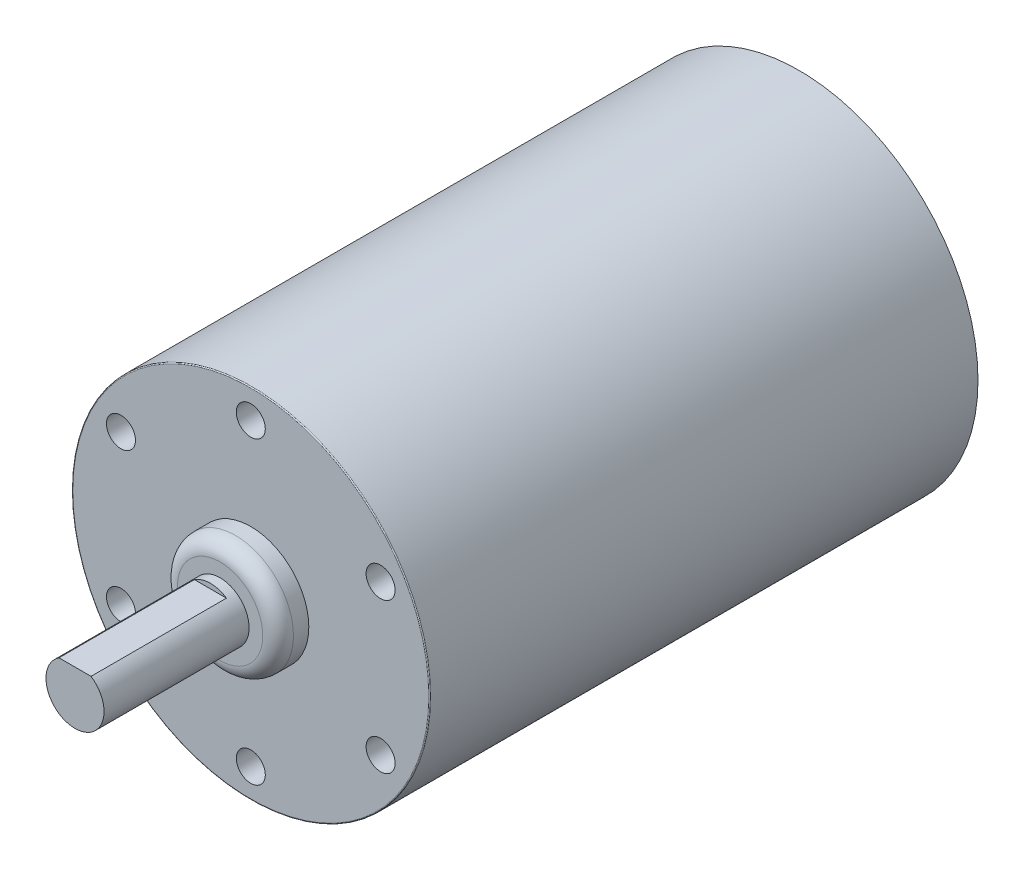
ISO-10303-21;
HEADER;
FILE_DESCRIPTION(('STEP AP214'),'2;1');
FILE_NAME('part.step','',(''),(''),'','','');
FILE_SCHEMA(('AUTOMOTIVE_DESIGN { 1 0 10303 214 1 1 1 1 }'));
ENDSEC;
DATA;
#1=APPLICATION_CONTEXT('core data for automotive mechanical design processes');
#2=APPLICATION_PROTOCOL_DEFINITION('international standard','automotive_design',2000,#1);
#3=PRODUCT_CONTEXT('',#1,'mechanical');
#4=PRODUCT('Part','Part','',(#3));
#5=PRODUCT_RELATED_PRODUCT_CATEGORY('part','',(#4));
#6=PRODUCT_DEFINITION_FORMATION('','',#4);
#7=PRODUCT_DEFINITION_CONTEXT('part definition',#1,'design');
#8=PRODUCT_DEFINITION('design','',#6,#7);
#9=PRODUCT_DEFINITION_SHAPE('','',#8);
#10=(LENGTH_UNIT() NAMED_UNIT(*) SI_UNIT(.MILLI.,.METRE.));
#11=(NAMED_UNIT(*) PLANE_ANGLE_UNIT() SI_UNIT($,.RADIAN.));
#12=(NAMED_UNIT(*) SI_UNIT($,.STERADIAN.) SOLID_ANGLE_UNIT());
#13=UNCERTAINTY_MEASURE_WITH_UNIT(LENGTH_MEASURE(1.E-05),#10,'distance_accuracy_value','');
#14=(GEOMETRIC_REPRESENTATION_CONTEXT(3) GLOBAL_UNCERTAINTY_ASSIGNED_CONTEXT((#13)) GLOBAL_UNIT_ASSIGNED_CONTEXT((#10,
#11,#12)) REPRESENTATION_CONTEXT('',''));
#15=CARTESIAN_POINT('',(0.,0.,0.));
#16=DIRECTION('',(0.,0.,1.));
#17=DIRECTION('',(1.,0.,0.));
#18=AXIS2_PLACEMENT_3D('',#15,#16,#17);
#19=CARTESIAN_POINT('',(0.,0.,56.6928));
#20=DIRECTION('',(0.,0.,-1.));
#21=DIRECTION('',(-1.,0.,0.));
#22=AXIS2_PLACEMENT_3D('',#19,#20,#21);
#23=CYLINDRICAL_SURFACE('',#22,18.5);
#24=CARTESIAN_POINT('',(0.,0.,56.5928));
#25=DIRECTION('',(0.,0.,1.));
#26=DIRECTION('',(1.,0.,0.));
#27=AXIS2_PLACEMENT_3D('',#24,#25,#26);
#28=CIRCLE('',#27,18.5);
#29=CARTESIAN_POINT('',(18.5,0.,56.5928));
#30=VERTEX_POINT('',#29);
#31=EDGE_CURVE('E94',#30,#30,#28,.F.);
#32=ORIENTED_EDGE('',*,*,#31,.T.);
#33=EDGE_LOOP('',(#32));
#34=FACE_BOUND('',#33,.T.);
#35=CARTESIAN_POINT('',(0.,0.,0.));
#36=DIRECTION('',(0.,0.,1.));
#37=DIRECTION('',(1.,0.,0.));
#38=AXIS2_PLACEMENT_3D('',#35,#36,#37);
#39=CIRCLE('',#38,18.5);
#40=CARTESIAN_POINT('',(18.5,0.,0.));
#41=VERTEX_POINT('',#40);
#42=EDGE_CURVE('E83',#41,#41,#39,.T.);
#43=ORIENTED_EDGE('',*,*,#42,.T.);
#44=EDGE_LOOP('',(#43));
#45=FACE_BOUND('',#44,.T.);
#46=ADVANCED_FACE('F38',(#34,#45),#23,.T.);
#47=CARTESIAN_POINT('',(0.,0.,56.6928));
#48=DIRECTION('',(0.,0.,1.));
#49=DIRECTION('',(1.,0.,0.));
#50=AXIS2_PLACEMENT_3D('',#47,#48,#49);
#51=PLANE('',#50);
#52=CARTESIAN_POINT('',(0.,15.5,56.6928));
#53=DIRECTION('',(0.,0.,1.));
#54=DIRECTION('',(1.,0.,0.));
#55=AXIS2_PLACEMENT_3D('',#52,#53,#54);
#56=CIRCLE('',#55,1.5);
#57=CARTESIAN_POINT('',(1.5,15.5,56.6928));
#58=VERTEX_POINT('',#57);
#59=EDGE_CURVE('E323',#58,#58,#56,.T.);
#60=ORIENTED_EDGE('',*,*,#59,.F.);
#61=EDGE_LOOP('',(#60));
#62=FACE_BOUND('',#61,.T.);
#63=CARTESIAN_POINT('',(-13.4233937586588,7.75,56.6928));
#64=DIRECTION('',(0.,0.,1.));
#65=DIRECTION('',(1.,0.,0.));
#66=AXIS2_PLACEMENT_3D('',#63,#64,#65);
#67=CIRCLE('',#66,1.5);
#68=CARTESIAN_POINT('',(-11.9233937586588,7.75,56.6928));
#69=VERTEX_POINT('',#68);
#70=EDGE_CURVE('E329',#69,#69,#67,.T.);
#71=ORIENTED_EDGE('',*,*,#70,.F.);
#72=EDGE_LOOP('',(#71));
#73=FACE_BOUND('',#72,.T.);
#74=CARTESIAN_POINT('',(-13.4233937586588,-7.75000000000001,56.6928));
#75=DIRECTION('',(0.,0.,1.));
#76=DIRECTION('',(1.,0.,0.));
#77=AXIS2_PLACEMENT_3D('',#74,#75,#76);
#78=CIRCLE('',#77,1.5);
#79=CARTESIAN_POINT('',(-11.9233937586588,-7.75000000000001,56.6928));
#80=VERTEX_POINT('',#79);
#81=EDGE_CURVE('E353',#80,#80,#78,.T.);
#82=ORIENTED_EDGE('',*,*,#81,.F.);
#83=EDGE_LOOP('',(#82));
#84=FACE_BOUND('',#83,.T.);
#85=CARTESIAN_POINT('',(0.,-15.5,56.6928));
#86=DIRECTION('',(0.,0.,1.));
#87=DIRECTION('',(1.,0.,0.));
#88=AXIS2_PLACEMENT_3D('',#85,#86,#87);
#89=CIRCLE('',#88,1.5);
#90=CARTESIAN_POINT('',(1.5,-15.5,56.6928));
#91=VERTEX_POINT('',#90);
#92=EDGE_CURVE('E347',#91,#91,#89,.T.);
#93=ORIENTED_EDGE('',*,*,#92,.F.);
#94=EDGE_LOOP('',(#93));
#95=FACE_BOUND('',#94,.T.);
#96=CARTESIAN_POINT('',(13.4233937586588,-7.75,56.6928));
#97=DIRECTION('',(0.,0.,1.));
#98=DIRECTION('',(1.,0.,0.));
#99=AXIS2_PLACEMENT_3D('',#96,#97,#98);
#100=CIRCLE('',#99,1.5);
#101=CARTESIAN_POINT('',(14.9233937586588,-7.75,56.6928));
#102=VERTEX_POINT('',#101);
#103=EDGE_CURVE('E341',#102,#102,#100,.T.);
#104=ORIENTED_EDGE('',*,*,#103,.F.);
#105=EDGE_LOOP('',(#104));
#106=FACE_BOUND('',#105,.T.);
#107=CARTESIAN_POINT('',(13.4233937586588,7.75,56.6928));
#108=DIRECTION('',(0.,0.,1.));
#109=DIRECTION('',(1.,0.,0.));
#110=AXIS2_PLACEMENT_3D('',#107,#108,#109);
#111=CIRCLE('',#110,1.5);
#112=CARTESIAN_POINT('',(14.9233937586588,7.75,56.6928));
#113=VERTEX_POINT('',#112);
#114=EDGE_CURVE('E326',#113,#113,#111,.T.);
#115=ORIENTED_EDGE('',*,*,#114,.F.);
#116=EDGE_LOOP('',(#115));
#117=FACE_BOUND('',#116,.T.);
#118=CARTESIAN_POINT('',(0.,0.,56.6928));
#119=DIRECTION('',(0.,0.,1.));
#120=DIRECTION('',(1.,0.,0.));
#121=AXIS2_PLACEMENT_3D('',#118,#119,#120);
#122=CIRCLE('',#121,6.);
#123=CARTESIAN_POINT('',(6.,0.,56.6928));
#124=VERTEX_POINT('',#123);
#125=EDGE_CURVE('E80',#124,#124,#122,.T.);
#126=ORIENTED_EDGE('',*,*,#125,.F.);
#127=EDGE_LOOP('',(#126));
#128=FACE_BOUND('',#127,.T.);
#129=CARTESIAN_POINT('',(0.,0.,56.6928));
#130=DIRECTION('',(0.,0.,1.));
#131=DIRECTION('',(1.,0.,0.));
#132=AXIS2_PLACEMENT_3D('',#129,#130,#131);
#133=CIRCLE('',#132,18.4);
#134=CARTESIAN_POINT('',(18.4,0.,56.6928));
#135=VERTEX_POINT('',#134);
#136=EDGE_CURVE('E91',#135,#135,#133,.T.);
#137=ORIENTED_EDGE('',*,*,#136,.T.);
#138=EDGE_LOOP('',(#137));
#139=FACE_BOUND('',#138,.T.);
#140=ADVANCED_FACE('F114',(#62,#73,#84,#95,#106,#117,#128,#139),#51,.T.);
#141=CARTESIAN_POINT('',(0.,0.,0.));
#142=DIRECTION('',(0.,0.,1.));
#143=DIRECTION('',(1.,0.,0.));
#144=AXIS2_PLACEMENT_3D('',#141,#142,#143);
#145=PLANE('',#144);
#146=ORIENTED_EDGE('',*,*,#42,.F.);
#147=EDGE_LOOP('',(#146));
#148=FACE_BOUND('',#147,.T.);
#149=ADVANCED_FACE('F122',(#148),#145,.F.);
#150=CARTESIAN_POINT('',(0.,0.,56.5928));
#151=DIRECTION('',(0.,0.,1.));
#152=DIRECTION('',(1.,0.,0.));
#153=AXIS2_PLACEMENT_3D('',#150,#151,#152);
#154=TOROIDAL_SURFACE('',#153,18.4,0.1);
#155=ORIENTED_EDGE('',*,*,#31,.F.);
#156=EDGE_LOOP('',(#155));
#157=FACE_BOUND('',#156,.T.);
#158=ORIENTED_EDGE('',*,*,#136,.F.);
#159=EDGE_LOOP('',(#158));
#160=FACE_BOUND('',#159,.T.);
#161=ADVANCED_FACE('F127',(#157,#160),#154,.T.);
#162=CARTESIAN_POINT('',(0.,0.,59.8678));
#163=DIRECTION('',(0.,0.,-1.));
#164=DIRECTION('',(-1.,0.,0.));
#165=AXIS2_PLACEMENT_3D('',#162,#163,#164);
#166=CYLINDRICAL_SURFACE('',#165,6.);
#167=CARTESIAN_POINT('',(0.,0.,58.2803));
#168=DIRECTION('',(0.,0.,1.));
#169=DIRECTION('',(1.,0.,0.));
#170=AXIS2_PLACEMENT_3D('',#167,#168,#169);
#171=CIRCLE('',#170,6.);
#172=CARTESIAN_POINT('',(6.,0.,58.2803));
#173=VERTEX_POINT('',#172);
#174=EDGE_CURVE('E11',#173,#173,#171,.F.);
#175=ORIENTED_EDGE('',*,*,#174,.T.);
#176=EDGE_LOOP('',(#175));
#177=FACE_BOUND('',#176,.T.);
#178=ORIENTED_EDGE('',*,*,#125,.T.);
#179=EDGE_LOOP('',(#178));
#180=FACE_BOUND('',#179,.T.);
#181=ADVANCED_FACE('F109',(#177,#180),#166,.T.);
#182=CARTESIAN_POINT('',(0.,0.,59.8678));
#183=DIRECTION('',(0.,0.,1.));
#184=DIRECTION('',(1.,0.,0.));
#185=AXIS2_PLACEMENT_3D('',#182,#183,#184);
#186=PLANE('',#185);
#187=CARTESIAN_POINT('',(0.,0.,59.8678));
#188=DIRECTION('',(0.,0.,1.));
#189=DIRECTION('',(1.,0.,0.));
#190=AXIS2_PLACEMENT_3D('',#187,#188,#189);
#191=CIRCLE('',#190,3.);
#192=CARTESIAN_POINT('',(3.,0.,59.8678));
#193=VERTEX_POINT('',#192);
#194=EDGE_CURVE('E77',#193,#193,#191,.T.);
#195=ORIENTED_EDGE('',*,*,#194,.F.);
#196=EDGE_LOOP('',(#195));
#197=FACE_BOUND('',#196,.T.);
#198=CARTESIAN_POINT('',(0.,0.,59.8678));
#199=DIRECTION('',(0.,0.,1.));
#200=DIRECTION('',(1.,0.,0.));
#201=AXIS2_PLACEMENT_3D('',#198,#199,#200);
#202=CIRCLE('',#201,4.4125);
#203=CARTESIAN_POINT('',(4.4125,0.,59.8678));
#204=VERTEX_POINT('',#203);
#205=EDGE_CURVE('E46',#204,#204,#202,.T.);
#206=ORIENTED_EDGE('',*,*,#205,.T.);
#207=EDGE_LOOP('',(#206));
#208=FACE_BOUND('',#207,.T.);
#209=ADVANCED_FACE('F99',(#197,#208),#186,.T.);
#210=CARTESIAN_POINT('',(0.,0.,58.2803));
#211=DIRECTION('',(0.,0.,1.));
#212=DIRECTION('',(1.,0.,0.));
#213=AXIS2_PLACEMENT_3D('',#210,#211,#212);
#214=TOROIDAL_SURFACE('',#213,4.4125,1.5875);
#215=ORIENTED_EDGE('',*,*,#174,.F.);
#216=EDGE_LOOP('',(#215));
#217=FACE_BOUND('',#216,.T.);
#218=ORIENTED_EDGE('',*,*,#205,.F.);
#219=EDGE_LOOP('',(#218));
#220=FACE_BOUND('',#219,.T.);
#221=ADVANCED_FACE('F40',(#217,#220),#214,.T.);
#222=CARTESIAN_POINT('',(0.,0.,74.8678));
#223=DIRECTION('',(0.,0.,-1.));
#224=DIRECTION('',(-1.,0.,0.));
#225=AXIS2_PLACEMENT_3D('',#222,#223,#224);
#226=CYLINDRICAL_SURFACE('',#225,3.);
#227=CARTESIAN_POINT('',(0.,0.,74.8678));
#228=DIRECTION('',(0.,0.,1.));
#229=DIRECTION('',(1.,0.,0.));
#230=AXIS2_PLACEMENT_3D('',#227,#228,#229);
#231=CIRCLE('',#230,3.);
#232=CARTESIAN_POINT('',(-1.65831239517771,2.5,74.8678));
#233=VERTEX_POINT('',#232);
#234=CARTESIAN_POINT('',(1.65831239517771,2.5,74.8678));
#235=VERTEX_POINT('',#234);
#236=EDGE_CURVE('E76',#233,#235,#231,.T.);
#237=ORIENTED_EDGE('',*,*,#236,.F.);
#238=DIRECTION('',(0.,0.,1.));
#239=VECTOR('',#238,1.);
#240=CARTESIAN_POINT('',(-1.65831239517771,2.5,60.8678));
#241=LINE('',#240,#239);
#242=CARTESIAN_POINT('',(-1.65831239517771,2.5,60.8678));
#243=VERTEX_POINT('',#242);
#244=EDGE_CURVE('E53',#243,#233,#241,.T.);
#245=ORIENTED_EDGE('',*,*,#244,.F.);
#246=CARTESIAN_POINT('',(0.,0.,60.8678));
#247=DIRECTION('',(0.,0.,1.));
#248=DIRECTION('',(-1.,0.,0.));
#249=AXIS2_PLACEMENT_3D('',#246,#247,#248);
#250=CIRCLE('',#249,3.);
#251=CARTESIAN_POINT('',(1.65831239517771,2.5,60.8678));
#252=VERTEX_POINT('',#251);
#253=EDGE_CURVE('E69',#252,#243,#250,.T.);
#254=ORIENTED_EDGE('',*,*,#253,.F.);
#255=DIRECTION('',(0.,0.,1.));
#256=VECTOR('',#255,1.);
#257=CARTESIAN_POINT('',(1.65831239517771,2.5,60.8678));
#258=LINE('',#257,#256);
#259=EDGE_CURVE('E59',#252,#235,#258,.T.);
#260=ORIENTED_EDGE('',*,*,#259,.T.);
#261=EDGE_LOOP('',(#237,#245,#254,#260));
#262=FACE_BOUND('',#261,.T.);
#263=ORIENTED_EDGE('',*,*,#194,.T.);
#264=EDGE_LOOP('',(#263));
#265=FACE_BOUND('',#264,.T.);
#266=ADVANCED_FACE('F74',(#262,#265),#226,.T.);
#267=CARTESIAN_POINT('',(0.,0.,74.8678));
#268=DIRECTION('',(0.,0.,1.));
#269=DIRECTION('',(1.,0.,0.));
#270=AXIS2_PLACEMENT_3D('',#267,#268,#269);
#271=PLANE('',#270);
#272=DIRECTION('',(1.,0.,0.));
#273=VECTOR('',#272,1.);
#274=CARTESIAN_POINT('',(-1.65831239517771,2.5,74.8678));
#275=LINE('',#274,#273);
#276=EDGE_CURVE('E64',#233,#235,#275,.T.);
#277=ORIENTED_EDGE('',*,*,#276,.F.);
#278=ORIENTED_EDGE('',*,*,#236,.T.);
#279=EDGE_LOOP('',(#277,#278));
#280=FACE_BOUND('',#279,.T.);
#281=ADVANCED_FACE('F79',(#280),#271,.T.);
#282=CARTESIAN_POINT('',(-1.65831239517771,2.5,60.8678));
#283=DIRECTION('',(0.,-1.,0.));
#284=DIRECTION('',(0.,0.,-1.));
#285=AXIS2_PLACEMENT_3D('',#282,#283,#284);
#286=PLANE('',#285);
#287=ORIENTED_EDGE('',*,*,#276,.T.);
#288=ORIENTED_EDGE('',*,*,#259,.F.);
#289=DIRECTION('',(1.,0.,0.));
#290=VECTOR('',#289,1.);
#291=CARTESIAN_POINT('',(-1.65831239517771,2.5,60.8678));
#292=LINE('',#291,#290);
#293=EDGE_CURVE('E359',#243,#252,#292,.T.);
#294=ORIENTED_EDGE('',*,*,#293,.F.);
#295=ORIENTED_EDGE('',*,*,#244,.T.);
#296=EDGE_LOOP('',(#287,#288,#294,#295));
#297=FACE_BOUND('',#296,.T.);
#298=ADVANCED_FACE('F65',(#297),#286,.F.);
#299=CARTESIAN_POINT('',(0.,0.,60.8678));
#300=DIRECTION('',(0.,0.,-1.));
#301=DIRECTION('',(-1.,0.,0.));
#302=AXIS2_PLACEMENT_3D('',#299,#300,#301);
#303=PLANE('',#302);
#304=ORIENTED_EDGE('',*,*,#253,.T.);
#305=ORIENTED_EDGE('',*,*,#293,.T.);
#306=EDGE_LOOP('',(#304,#305));
#307=FACE_BOUND('',#306,.T.);
#308=ADVANCED_FACE('F189',(#307),#303,.F.);
#309=CARTESIAN_POINT('',(13.4233937586588,7.75,46.6928));
#310=DIRECTION('',(0.,0.,1.));
#311=DIRECTION('',(1.,0.,0.));
#312=AXIS2_PLACEMENT_3D('',#309,#310,#311);
#313=CYLINDRICAL_SURFACE('',#312,1.5);
#314=CARTESIAN_POINT('',(13.4233937586588,7.75,46.6928));
#315=DIRECTION('',(0.,0.,1.));
#316=DIRECTION('',(1.,0.,0.));
#317=AXIS2_PLACEMENT_3D('',#314,#315,#316);
#318=CIRCLE('',#317,1.5);
#319=CARTESIAN_POINT('',(14.9233937586588,7.75,46.6928));
#320=VERTEX_POINT('',#319);
#321=EDGE_CURVE('E338',#320,#320,#318,.T.);
#322=ORIENTED_EDGE('',*,*,#321,.F.);
#323=EDGE_LOOP('',(#322));
#324=FACE_BOUND('',#323,.T.);
#325=ORIENTED_EDGE('',*,*,#114,.T.);
#326=EDGE_LOOP('',(#325));
#327=FACE_BOUND('',#326,.T.);
#328=ADVANCED_FACE('F198',(#324,#327),#313,.F.);
#329=CARTESIAN_POINT('',(13.4233937586588,7.75,46.6928));
#330=DIRECTION('',(0.,0.,1.));
#331=DIRECTION('',(1.,0.,0.));
#332=AXIS2_PLACEMENT_3D('',#329,#330,#331);
#333=PLANE('',#332);
#334=ORIENTED_EDGE('',*,*,#321,.T.);
#335=EDGE_LOOP('',(#334));
#336=FACE_BOUND('',#335,.T.);
#337=ADVANCED_FACE('F208',(#336),#333,.T.);
#338=CARTESIAN_POINT('',(13.4233937586588,-7.75,46.6928));
#339=DIRECTION('',(0.,0.,1.));
#340=DIRECTION('',(1.,0.,0.));
#341=AXIS2_PLACEMENT_3D('',#338,#339,#340);
#342=CYLINDRICAL_SURFACE('',#341,1.5);
#343=CARTESIAN_POINT('',(13.4233937586588,-7.75,46.6928));
#344=DIRECTION('',(0.,0.,1.));
#345=DIRECTION('',(1.,0.,0.));
#346=AXIS2_PLACEMENT_3D('',#343,#344,#345);
#347=CIRCLE('',#346,1.5);
#348=CARTESIAN_POINT('',(14.9233937586588,-7.75,46.6928));
#349=VERTEX_POINT('',#348);
#350=EDGE_CURVE('E344',#349,#349,#347,.T.);
#351=ORIENTED_EDGE('',*,*,#350,.F.);
#352=EDGE_LOOP('',(#351));
#353=FACE_BOUND('',#352,.T.);
#354=ORIENTED_EDGE('',*,*,#103,.T.);
#355=EDGE_LOOP('',(#354));
#356=FACE_BOUND('',#355,.T.);
#357=ADVANCED_FACE('F218',(#353,#356),#342,.F.);
#358=CARTESIAN_POINT('',(13.4233937586588,-7.75,46.6928));
#359=DIRECTION('',(0.,0.,1.));
#360=DIRECTION('',(1.,0.,0.));
#361=AXIS2_PLACEMENT_3D('',#358,#359,#360);
#362=PLANE('',#361);
#363=ORIENTED_EDGE('',*,*,#350,.T.);
#364=EDGE_LOOP('',(#363));
#365=FACE_BOUND('',#364,.T.);
#366=ADVANCED_FACE('F228',(#365),#362,.T.);
#367=CARTESIAN_POINT('',(0.,-15.5,46.6928));
#368=DIRECTION('',(0.,0.,1.));
#369=DIRECTION('',(1.,0.,0.));
#370=AXIS2_PLACEMENT_3D('',#367,#368,#369);
#371=CYLINDRICAL_SURFACE('',#370,1.5);
#372=CARTESIAN_POINT('',(0.,-15.5,46.6928));
#373=DIRECTION('',(0.,0.,1.));
#374=DIRECTION('',(1.,0.,0.));
#375=AXIS2_PLACEMENT_3D('',#372,#373,#374);
#376=CIRCLE('',#375,1.5);
#377=CARTESIAN_POINT('',(1.5,-15.5,46.6928));
#378=VERTEX_POINT('',#377);
#379=EDGE_CURVE('E350',#378,#378,#376,.T.);
#380=ORIENTED_EDGE('',*,*,#379,.F.);
#381=EDGE_LOOP('',(#380));
#382=FACE_BOUND('',#381,.T.);
#383=ORIENTED_EDGE('',*,*,#92,.T.);
#384=EDGE_LOOP('',(#383));
#385=FACE_BOUND('',#384,.T.);
#386=ADVANCED_FACE('F238',(#382,#385),#371,.F.);
#387=CARTESIAN_POINT('',(0.,-15.5,46.6928));
#388=DIRECTION('',(0.,0.,1.));
#389=DIRECTION('',(1.,0.,0.));
#390=AXIS2_PLACEMENT_3D('',#387,#388,#389);
#391=PLANE('',#390);
#392=ORIENTED_EDGE('',*,*,#379,.T.);
#393=EDGE_LOOP('',(#392));
#394=FACE_BOUND('',#393,.T.);
#395=ADVANCED_FACE('F248',(#394),#391,.T.);
#396=CARTESIAN_POINT('',(-13.4233937586588,-7.75000000000001,46.6928));
#397=DIRECTION('',(0.,0.,1.));
#398=DIRECTION('',(1.,0.,0.));
#399=AXIS2_PLACEMENT_3D('',#396,#397,#398);
#400=CYLINDRICAL_SURFACE('',#399,1.5);
#401=CARTESIAN_POINT('',(-13.4233937586588,-7.75000000000001,46.6928));
#402=DIRECTION('',(0.,0.,1.));
#403=DIRECTION('',(1.,0.,0.));
#404=AXIS2_PLACEMENT_3D('',#401,#402,#403);
#405=CIRCLE('',#404,1.5);
#406=CARTESIAN_POINT('',(-11.9233937586588,-7.75000000000001,46.6928));
#407=VERTEX_POINT('',#406);
#408=EDGE_CURVE('E332',#407,#407,#405,.T.);
#409=ORIENTED_EDGE('',*,*,#408,.F.);
#410=EDGE_LOOP('',(#409));
#411=FACE_BOUND('',#410,.T.);
#412=ORIENTED_EDGE('',*,*,#81,.T.);
#413=EDGE_LOOP('',(#412));
#414=FACE_BOUND('',#413,.T.);
#415=ADVANCED_FACE('F258',(#411,#414),#400,.F.);
#416=CARTESIAN_POINT('',(-13.4233937586588,-7.75000000000001,46.6928));
#417=DIRECTION('',(0.,0.,1.));
#418=DIRECTION('',(1.,0.,0.));
#419=AXIS2_PLACEMENT_3D('',#416,#417,#418);
#420=PLANE('',#419);
#421=ORIENTED_EDGE('',*,*,#408,.T.);
#422=EDGE_LOOP('',(#421));
#423=FACE_BOUND('',#422,.T.);
#424=ADVANCED_FACE('F268',(#423),#420,.T.);
#425=CARTESIAN_POINT('',(-13.4233937586588,7.75,46.6928));
#426=DIRECTION('',(0.,0.,1.));
#427=DIRECTION('',(1.,0.,0.));
#428=AXIS2_PLACEMENT_3D('',#425,#426,#427);
#429=CYLINDRICAL_SURFACE('',#428,1.5);
#430=CARTESIAN_POINT('',(-13.4233937586588,7.75,46.6928));
#431=DIRECTION('',(0.,0.,1.));
#432=DIRECTION('',(1.,0.,0.));
#433=AXIS2_PLACEMENT_3D('',#430,#431,#432);
#434=CIRCLE('',#433,1.5);
#435=CARTESIAN_POINT('',(-11.9233937586588,7.75,46.6928));
#436=VERTEX_POINT('',#435);
#437=EDGE_CURVE('E333',#436,#436,#434,.T.);
#438=ORIENTED_EDGE('',*,*,#437,.F.);
#439=EDGE_LOOP('',(#438));
#440=FACE_BOUND('',#439,.T.);
#441=ORIENTED_EDGE('',*,*,#70,.T.);
#442=EDGE_LOOP('',(#441));
#443=FACE_BOUND('',#442,.T.);
#444=ADVANCED_FACE('F278',(#440,#443),#429,.F.);
#445=CARTESIAN_POINT('',(-13.4233937586588,7.75,46.6928));
#446=DIRECTION('',(0.,0.,1.));
#447=DIRECTION('',(1.,0.,0.));
#448=AXIS2_PLACEMENT_3D('',#445,#446,#447);
#449=PLANE('',#448);
#450=ORIENTED_EDGE('',*,*,#437,.T.);
#451=EDGE_LOOP('',(#450));
#452=FACE_BOUND('',#451,.T.);
#453=ADVANCED_FACE('F288',(#452),#449,.T.);
#454=CARTESIAN_POINT('',(0.,15.5,46.6928));
#455=DIRECTION('',(0.,0.,1.));
#456=DIRECTION('',(1.,0.,0.));
#457=AXIS2_PLACEMENT_3D('',#454,#455,#456);
#458=CYLINDRICAL_SURFACE('',#457,1.5);
#459=CARTESIAN_POINT('',(0.,15.5,46.6928));
#460=DIRECTION('',(0.,0.,1.));
#461=DIRECTION('',(1.,0.,0.));
#462=AXIS2_PLACEMENT_3D('',#459,#460,#461);
#463=CIRCLE('',#462,1.5);
#464=CARTESIAN_POINT('',(1.5,15.5,46.6928));
#465=VERTEX_POINT('',#464);
#466=EDGE_CURVE('E70',#465,#465,#463,.T.);
#467=ORIENTED_EDGE('',*,*,#466,.F.);
#468=EDGE_LOOP('',(#467));
#469=FACE_BOUND('',#468,.T.);
#470=ORIENTED_EDGE('',*,*,#59,.T.);
#471=EDGE_LOOP('',(#470));
#472=FACE_BOUND('',#471,.T.);
#473=ADVANCED_FACE('F298',(#469,#472),#458,.F.);
#474=CARTESIAN_POINT('',(0.,15.5,46.6928));
#475=DIRECTION('',(0.,0.,1.));
#476=DIRECTION('',(1.,0.,0.));
#477=AXIS2_PLACEMENT_3D('',#474,#475,#476);
#478=PLANE('',#477);
#479=ORIENTED_EDGE('',*,*,#466,.T.);
#480=EDGE_LOOP('',(#479));
#481=FACE_BOUND('',#480,.T.);
#482=ADVANCED_FACE('F308',(#481),#478,.T.);
#483=CLOSED_SHELL('',(#46,#140,#149,#161,#181,#209,#221,#266,#281,#298,#308,#328,#337,#357,#366,
#386,#395,#415,#424,#444,#453,#473,#482));
#484=MANIFOLD_SOLID_BREP('B2',#483);
#485=ADVANCED_BREP_SHAPE_REPRESENTATION('',(#18,#484),#14);
#486=SHAPE_DEFINITION_REPRESENTATION(#9,#485);
ENDSEC;
END-ISO-10303-21;
